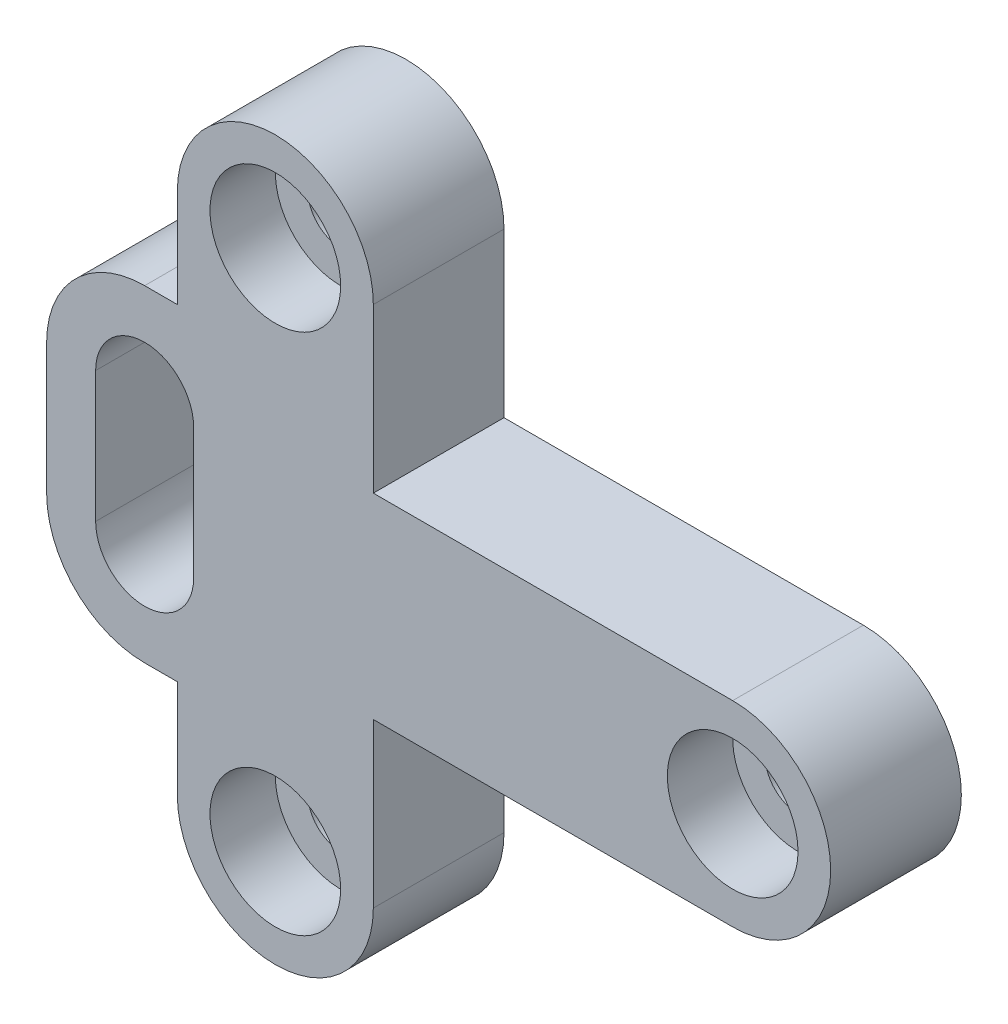
ISO-10303-21;
HEADER;
FILE_DESCRIPTION(('STEP AP214'),'2;1');
FILE_NAME('part.step','',(''),(''),'','','');
FILE_SCHEMA(('AUTOMOTIVE_DESIGN { 1 0 10303 214 1 1 1 1 }'));
ENDSEC;
DATA;
#1=APPLICATION_CONTEXT('core data for automotive mechanical design processes');
#2=APPLICATION_PROTOCOL_DEFINITION('international standard','automotive_design',2000,#1);
#3=PRODUCT_CONTEXT('',#1,'mechanical');
#4=PRODUCT('Part','Part','',(#3));
#5=PRODUCT_RELATED_PRODUCT_CATEGORY('part','',(#4));
#6=PRODUCT_DEFINITION_FORMATION('','',#4);
#7=PRODUCT_DEFINITION_CONTEXT('part definition',#1,'design');
#8=PRODUCT_DEFINITION('design','',#6,#7);
#9=PRODUCT_DEFINITION_SHAPE('','',#8);
#10=(LENGTH_UNIT() NAMED_UNIT(*) SI_UNIT(.MILLI.,.METRE.));
#11=(NAMED_UNIT(*) PLANE_ANGLE_UNIT() SI_UNIT($,.RADIAN.));
#12=(NAMED_UNIT(*) SI_UNIT($,.STERADIAN.) SOLID_ANGLE_UNIT());
#13=UNCERTAINTY_MEASURE_WITH_UNIT(LENGTH_MEASURE(1.E-05),#10,'distance_accuracy_value','');
#14=(GEOMETRIC_REPRESENTATION_CONTEXT(3) GLOBAL_UNCERTAINTY_ASSIGNED_CONTEXT((#13)) GLOBAL_UNIT_ASSIGNED_CONTEXT((#10,
#11,#12)) REPRESENTATION_CONTEXT('',''));
#15=CARTESIAN_POINT('',(0.,0.,0.));
#16=DIRECTION('',(0.,0.,1.));
#17=DIRECTION('',(1.,0.,0.));
#18=AXIS2_PLACEMENT_3D('',#15,#16,#17);
#19=CARTESIAN_POINT('',(-20.,-10.,20.));
#20=DIRECTION('',(0.,0.,-1.));
#21=DIRECTION('',(-1.,0.,0.));
#22=AXIS2_PLACEMENT_3D('',#19,#20,#21);
#23=CYLINDRICAL_SURFACE('',#22,7.5);
#24=CARTESIAN_POINT('',(-20.,-10.,0.));
#25=DIRECTION('',(0.,0.,1.));
#26=DIRECTION('',(1.,0.,0.));
#27=AXIS2_PLACEMENT_3D('',#24,#25,#26);
#28=CIRCLE('',#27,7.5);
#29=CARTESIAN_POINT('',(-27.5,-10.,0.));
#30=VERTEX_POINT('',#29);
#31=CARTESIAN_POINT('',(-12.5,-10.,0.));
#32=VERTEX_POINT('',#31);
#33=EDGE_CURVE('E241',#30,#32,#28,.T.);
#34=ORIENTED_EDGE('',*,*,#33,.F.);
#35=DIRECTION('',(0.,0.,-1.));
#36=VECTOR('',#35,1.);
#37=CARTESIAN_POINT('',(-27.5,-10.,20.));
#38=LINE('',#37,#36);
#39=CARTESIAN_POINT('',(-27.5,-10.,20.));
#40=VERTEX_POINT('',#39);
#41=EDGE_CURVE('E46',#40,#30,#38,.T.);
#42=ORIENTED_EDGE('',*,*,#41,.F.);
#43=CARTESIAN_POINT('',(-20.,-10.,20.));
#44=DIRECTION('',(0.,0.,1.));
#45=DIRECTION('',(1.,0.,0.));
#46=AXIS2_PLACEMENT_3D('',#43,#44,#45);
#47=CIRCLE('',#46,7.5);
#48=CARTESIAN_POINT('',(-12.5,-10.,20.));
#49=VERTEX_POINT('',#48);
#50=EDGE_CURVE('E187',#40,#49,#47,.T.);
#51=ORIENTED_EDGE('',*,*,#50,.T.);
#52=DIRECTION('',(0.,0.,-1.));
#53=VECTOR('',#52,1.);
#54=CARTESIAN_POINT('',(-12.5,-10.,20.));
#55=LINE('',#54,#53);
#56=EDGE_CURVE('E119',#49,#32,#55,.T.);
#57=ORIENTED_EDGE('',*,*,#56,.T.);
#58=EDGE_LOOP('',(#34,#42,#51,#57));
#59=FACE_BOUND('',#58,.T.);
#60=ADVANCED_FACE('F37',(#59),#23,.F.);
#61=CARTESIAN_POINT('',(-27.5,0.,20.));
#62=DIRECTION('',(1.,0.,0.));
#63=DIRECTION('',(0.,0.,-1.));
#64=AXIS2_PLACEMENT_3D('',#61,#62,#63);
#65=PLANE('',#64);
#66=DIRECTION('',(0.,-1.,0.));
#67=VECTOR('',#66,1.);
#68=CARTESIAN_POINT('',(-27.5,0.,0.));
#69=LINE('',#68,#67);
#70=CARTESIAN_POINT('',(-27.5,10.,0.));
#71=VERTEX_POINT('',#70);
#72=EDGE_CURVE('E178',#71,#30,#69,.T.);
#73=ORIENTED_EDGE('',*,*,#72,.F.);
#74=DIRECTION('',(0.,0.,-1.));
#75=VECTOR('',#74,1.);
#76=CARTESIAN_POINT('',(-27.5,10.,20.));
#77=LINE('',#76,#75);
#78=CARTESIAN_POINT('',(-27.5,10.,20.));
#79=VERTEX_POINT('',#78);
#80=EDGE_CURVE('E173',#79,#71,#77,.T.);
#81=ORIENTED_EDGE('',*,*,#80,.F.);
#82=DIRECTION('',(0.,-1.,0.));
#83=VECTOR('',#82,1.);
#84=CARTESIAN_POINT('',(-27.5,0.,20.));
#85=LINE('',#84,#83);
#86=EDGE_CURVE('E176',#79,#40,#85,.T.);
#87=ORIENTED_EDGE('',*,*,#86,.T.);
#88=ORIENTED_EDGE('',*,*,#41,.T.);
#89=EDGE_LOOP('',(#73,#81,#87,#88));
#90=FACE_BOUND('',#89,.T.);
#91=ADVANCED_FACE('F175',(#90),#65,.T.);
#92=CARTESIAN_POINT('',(-20.,10.,20.));
#93=DIRECTION('',(0.,0.,-1.));
#94=DIRECTION('',(-1.,0.,0.));
#95=AXIS2_PLACEMENT_3D('',#92,#93,#94);
#96=CYLINDRICAL_SURFACE('',#95,7.5);
#97=CARTESIAN_POINT('',(-20.,10.,0.));
#98=DIRECTION('',(0.,0.,1.));
#99=DIRECTION('',(1.,0.,0.));
#100=AXIS2_PLACEMENT_3D('',#97,#98,#99);
#101=CIRCLE('',#100,7.5);
#102=CARTESIAN_POINT('',(-12.5,10.,0.));
#103=VERTEX_POINT('',#102);
#104=EDGE_CURVE('E245',#103,#71,#101,.T.);
#105=ORIENTED_EDGE('',*,*,#104,.F.);
#106=DIRECTION('',(0.,0.,-1.));
#107=VECTOR('',#106,1.);
#108=CARTESIAN_POINT('',(-12.5,10.,20.));
#109=LINE('',#108,#107);
#110=CARTESIAN_POINT('',(-12.5,10.,20.));
#111=VERTEX_POINT('',#110);
#112=EDGE_CURVE('E112',#111,#103,#109,.T.);
#113=ORIENTED_EDGE('',*,*,#112,.F.);
#114=CARTESIAN_POINT('',(-20.,10.,20.));
#115=DIRECTION('',(0.,0.,1.));
#116=DIRECTION('',(1.,0.,0.));
#117=AXIS2_PLACEMENT_3D('',#114,#115,#116);
#118=CIRCLE('',#117,7.5);
#119=EDGE_CURVE('E186',#111,#79,#118,.T.);
#120=ORIENTED_EDGE('',*,*,#119,.T.);
#121=ORIENTED_EDGE('',*,*,#80,.T.);
#122=EDGE_LOOP('',(#105,#113,#120,#121));
#123=FACE_BOUND('',#122,.T.);
#124=ADVANCED_FACE('F189',(#123),#96,.F.);
#125=CARTESIAN_POINT('',(0.,-15.,20.));
#126=DIRECTION('',(0.,1.,0.));
#127=DIRECTION('',(0.,0.,1.));
#128=AXIS2_PLACEMENT_3D('',#125,#126,#127);
#129=PLANE('',#128);
#130=DIRECTION('',(1.,0.,0.));
#131=VECTOR('',#130,1.);
#132=CARTESIAN_POINT('',(0.,-15.,0.));
#133=LINE('',#132,#131);
#134=CARTESIAN_POINT('',(15.0006073792908,-15.,0.));
#135=VERTEX_POINT('',#134);
#136=CARTESIAN_POINT('',(70.0006073792907,-15.,0.));
#137=VERTEX_POINT('',#136);
#138=EDGE_CURVE('E204',#135,#137,#133,.T.);
#139=ORIENTED_EDGE('',*,*,#138,.T.);
#140=DIRECTION('',(0.,0.,-1.));
#141=VECTOR('',#140,1.);
#142=CARTESIAN_POINT('',(70.0006073792907,-15.,20.));
#143=LINE('',#142,#141);
#144=CARTESIAN_POINT('',(70.0006073792907,-15.,20.));
#145=VERTEX_POINT('',#144);
#146=EDGE_CURVE('E251',#145,#137,#143,.T.);
#147=ORIENTED_EDGE('',*,*,#146,.F.);
#148=DIRECTION('',(1.,0.,0.));
#149=VECTOR('',#148,1.);
#150=CARTESIAN_POINT('',(0.,-15.,20.));
#151=LINE('',#150,#149);
#152=CARTESIAN_POINT('',(15.0006073792908,-15.,20.));
#153=VERTEX_POINT('',#152);
#154=EDGE_CURVE('E249',#153,#145,#151,.T.);
#155=ORIENTED_EDGE('',*,*,#154,.F.);
#156=DIRECTION('',(0.,0.,-1.));
#157=VECTOR('',#156,1.);
#158=CARTESIAN_POINT('',(15.0006073792908,-15.,20.));
#159=LINE('',#158,#157);
#160=EDGE_CURVE('E203',#153,#135,#159,.T.);
#161=ORIENTED_EDGE('',*,*,#160,.T.);
#162=EDGE_LOOP('',(#139,#147,#155,#161));
#163=FACE_BOUND('',#162,.T.);
#164=ADVANCED_FACE('F39',(#163),#129,.F.);
#165=CARTESIAN_POINT('',(70.0006073792907,0.,20.));
#166=DIRECTION('',(0.,0.,-1.));
#167=DIRECTION('',(-1.,0.,0.));
#168=AXIS2_PLACEMENT_3D('',#165,#166,#167);
#169=CYLINDRICAL_SURFACE('',#168,15.);
#170=CARTESIAN_POINT('',(70.0006073792907,0.,0.));
#171=DIRECTION('',(0.,0.,1.));
#172=DIRECTION('',(1.,0.,0.));
#173=AXIS2_PLACEMENT_3D('',#170,#171,#172);
#174=CIRCLE('',#173,15.);
#175=CARTESIAN_POINT('',(70.0006073792907,15.,0.));
#176=VERTEX_POINT('',#175);
#177=EDGE_CURVE('E207',#137,#176,#174,.T.);
#178=ORIENTED_EDGE('',*,*,#177,.T.);
#179=DIRECTION('',(0.,0.,-1.));
#180=VECTOR('',#179,1.);
#181=CARTESIAN_POINT('',(70.0006073792907,15.,20.));
#182=LINE('',#181,#180);
#183=CARTESIAN_POINT('',(70.0006073792907,15.,20.));
#184=VERTEX_POINT('',#183);
#185=EDGE_CURVE('E283',#184,#176,#182,.T.);
#186=ORIENTED_EDGE('',*,*,#185,.F.);
#187=CARTESIAN_POINT('',(70.0006073792907,0.,20.));
#188=DIRECTION('',(0.,0.,1.));
#189=DIRECTION('',(1.,0.,0.));
#190=AXIS2_PLACEMENT_3D('',#187,#188,#189);
#191=CIRCLE('',#190,15.);
#192=EDGE_CURVE('E127',#145,#184,#191,.T.);
#193=ORIENTED_EDGE('',*,*,#192,.F.);
#194=ORIENTED_EDGE('',*,*,#146,.T.);
#195=EDGE_LOOP('',(#178,#186,#193,#194));
#196=FACE_BOUND('',#195,.T.);
#197=ADVANCED_FACE('F285',(#196),#169,.T.);
#198=CARTESIAN_POINT('',(0.,15.,20.));
#199=DIRECTION('',(0.,1.,0.));
#200=DIRECTION('',(0.,0.,1.));
#201=AXIS2_PLACEMENT_3D('',#198,#199,#200);
#202=PLANE('',#201);
#203=DIRECTION('',(1.,0.,0.));
#204=VECTOR('',#203,1.);
#205=CARTESIAN_POINT('',(0.,15.,0.));
#206=LINE('',#205,#204);
#207=CARTESIAN_POINT('',(15.0006073792907,15.,0.));
#208=VERTEX_POINT('',#207);
#209=EDGE_CURVE('E211',#208,#176,#206,.T.);
#210=ORIENTED_EDGE('',*,*,#209,.F.);
#211=DIRECTION('',(0.,0.,-1.));
#212=VECTOR('',#211,1.);
#213=CARTESIAN_POINT('',(15.0006073792907,15.,20.));
#214=LINE('',#213,#212);
#215=CARTESIAN_POINT('',(15.0006073792907,15.,20.));
#216=VERTEX_POINT('',#215);
#217=EDGE_CURVE('E281',#216,#208,#214,.T.);
#218=ORIENTED_EDGE('',*,*,#217,.F.);
#219=DIRECTION('',(1.,0.,0.));
#220=VECTOR('',#219,1.);
#221=CARTESIAN_POINT('',(0.,15.,20.));
#222=LINE('',#221,#220);
#223=EDGE_CURVE('E362',#216,#184,#222,.T.);
#224=ORIENTED_EDGE('',*,*,#223,.T.);
#225=ORIENTED_EDGE('',*,*,#185,.T.);
#226=EDGE_LOOP('',(#210,#218,#224,#225));
#227=FACE_BOUND('',#226,.T.);
#228=ADVANCED_FACE('F359',(#227),#202,.T.);
#229=CARTESIAN_POINT('',(15.0006073792907,0.,20.));
#230=DIRECTION('',(1.,0.,0.));
#231=DIRECTION('',(0.,1.,0.));
#232=AXIS2_PLACEMENT_3D('',#229,#230,#231);
#233=PLANE('',#232);
#234=DIRECTION('',(0.,-1.,0.));
#235=VECTOR('',#234,1.);
#236=CARTESIAN_POINT('',(15.0006073792907,0.,0.));
#237=LINE('',#236,#235);
#238=CARTESIAN_POINT('',(15.0006073792907,40.,0.));
#239=VERTEX_POINT('',#238);
#240=EDGE_CURVE('E214',#239,#208,#237,.T.);
#241=ORIENTED_EDGE('',*,*,#240,.F.);
#242=DIRECTION('',(0.,0.,-1.));
#243=VECTOR('',#242,1.);
#244=CARTESIAN_POINT('',(15.0006073792907,40.,20.));
#245=LINE('',#244,#243);
#246=CARTESIAN_POINT('',(15.0006073792907,40.,20.));
#247=VERTEX_POINT('',#246);
#248=EDGE_CURVE('E279',#247,#239,#245,.T.);
#249=ORIENTED_EDGE('',*,*,#248,.F.);
#250=DIRECTION('',(0.,-1.,0.));
#251=VECTOR('',#250,1.);
#252=CARTESIAN_POINT('',(15.0006073792907,0.,20.));
#253=LINE('',#252,#251);
#254=EDGE_CURVE('E356',#247,#216,#253,.T.);
#255=ORIENTED_EDGE('',*,*,#254,.T.);
#256=ORIENTED_EDGE('',*,*,#217,.T.);
#257=EDGE_LOOP('',(#241,#249,#255,#256));
#258=FACE_BOUND('',#257,.T.);
#259=ADVANCED_FACE('F355',(#258),#233,.T.);
#260=CARTESIAN_POINT('',(0.000607379290722194,40.,20.));
#261=DIRECTION('',(0.,0.,-1.));
#262=DIRECTION('',(-1.,0.,0.));
#263=AXIS2_PLACEMENT_3D('',#260,#261,#262);
#264=CYLINDRICAL_SURFACE('',#263,15.);
#265=CARTESIAN_POINT('',(0.000607379290722194,40.,0.));
#266=DIRECTION('',(0.,0.,1.));
#267=DIRECTION('',(1.,0.,0.));
#268=AXIS2_PLACEMENT_3D('',#265,#266,#267);
#269=CIRCLE('',#268,15.);
#270=CARTESIAN_POINT('',(-14.9993926207093,40.,0.));
#271=VERTEX_POINT('',#270);
#272=EDGE_CURVE('E217',#239,#271,#269,.T.);
#273=ORIENTED_EDGE('',*,*,#272,.T.);
#274=DIRECTION('',(0.,0.,-1.));
#275=VECTOR('',#274,1.);
#276=CARTESIAN_POINT('',(-14.9993926207093,40.,20.));
#277=LINE('',#276,#275);
#278=CARTESIAN_POINT('',(-14.9993926207093,40.,20.));
#279=VERTEX_POINT('',#278);
#280=EDGE_CURVE('E276',#279,#271,#277,.T.);
#281=ORIENTED_EDGE('',*,*,#280,.F.);
#282=CARTESIAN_POINT('',(0.000607379290722194,40.,20.));
#283=DIRECTION('',(0.,0.,1.));
#284=DIRECTION('',(1.,0.,0.));
#285=AXIS2_PLACEMENT_3D('',#282,#283,#284);
#286=CIRCLE('',#285,15.);
#287=EDGE_CURVE('E351',#247,#279,#286,.T.);
#288=ORIENTED_EDGE('',*,*,#287,.F.);
#289=ORIENTED_EDGE('',*,*,#248,.T.);
#290=EDGE_LOOP('',(#273,#281,#288,#289));
#291=FACE_BOUND('',#290,.T.);
#292=ADVANCED_FACE('F350',(#291),#264,.T.);
#293=CARTESIAN_POINT('',(-14.9993926207092,0.,20.));
#294=DIRECTION('',(1.,0.,0.));
#295=DIRECTION('',(0.,1.,0.));
#296=AXIS2_PLACEMENT_3D('',#293,#294,#295);
#297=PLANE('',#296);
#298=DIRECTION('',(0.,-1.,0.));
#299=VECTOR('',#298,1.);
#300=CARTESIAN_POINT('',(-14.9993926207092,0.,0.));
#301=LINE('',#300,#299);
#302=CARTESIAN_POINT('',(-14.9993926207093,25.,0.));
#303=VERTEX_POINT('',#302);
#304=EDGE_CURVE('E219',#271,#303,#301,.T.);
#305=ORIENTED_EDGE('',*,*,#304,.T.);
#306=DIRECTION('',(0.,0.,-1.));
#307=VECTOR('',#306,1.);
#308=CARTESIAN_POINT('',(-14.9993926207093,25.,20.));
#309=LINE('',#308,#307);
#310=CARTESIAN_POINT('',(-14.9993926207093,25.,20.));
#311=VERTEX_POINT('',#310);
#312=EDGE_CURVE('E274',#311,#303,#309,.T.);
#313=ORIENTED_EDGE('',*,*,#312,.F.);
#314=DIRECTION('',(0.,-1.,0.));
#315=VECTOR('',#314,1.);
#316=CARTESIAN_POINT('',(-14.9993926207092,0.,20.));
#317=LINE('',#316,#315);
#318=EDGE_CURVE('E347',#279,#311,#317,.T.);
#319=ORIENTED_EDGE('',*,*,#318,.F.);
#320=ORIENTED_EDGE('',*,*,#280,.T.);
#321=EDGE_LOOP('',(#305,#313,#319,#320));
#322=FACE_BOUND('',#321,.T.);
#323=ADVANCED_FACE('F344',(#322),#297,.F.);
#324=CARTESIAN_POINT('',(0.,25.,20.));
#325=DIRECTION('',(0.,1.,0.));
#326=DIRECTION('',(0.,0.,1.));
#327=AXIS2_PLACEMENT_3D('',#324,#325,#326);
#328=PLANE('',#327);
#329=DIRECTION('',(1.,0.,0.));
#330=VECTOR('',#329,1.);
#331=CARTESIAN_POINT('',(0.,25.,0.));
#332=LINE('',#331,#330);
#333=CARTESIAN_POINT('',(-20.,25.,0.));
#334=VERTEX_POINT('',#333);
#335=EDGE_CURVE('E222',#334,#303,#332,.T.);
#336=ORIENTED_EDGE('',*,*,#335,.F.);
#337=DIRECTION('',(0.,0.,-1.));
#338=VECTOR('',#337,1.);
#339=CARTESIAN_POINT('',(-20.,25.,20.));
#340=LINE('',#339,#338);
#341=CARTESIAN_POINT('',(-20.,25.,20.));
#342=VERTEX_POINT('',#341);
#343=EDGE_CURVE('E272',#342,#334,#340,.T.);
#344=ORIENTED_EDGE('',*,*,#343,.F.);
#345=DIRECTION('',(1.,0.,0.));
#346=VECTOR('',#345,1.);
#347=CARTESIAN_POINT('',(0.,25.,20.));
#348=LINE('',#347,#346);
#349=EDGE_CURVE('E338',#342,#311,#348,.T.);
#350=ORIENTED_EDGE('',*,*,#349,.T.);
#351=ORIENTED_EDGE('',*,*,#312,.T.);
#352=EDGE_LOOP('',(#336,#344,#350,#351));
#353=FACE_BOUND('',#352,.T.);
#354=ADVANCED_FACE('F337',(#353),#328,.T.);
#355=CARTESIAN_POINT('',(-20.,10.,20.));
#356=DIRECTION('',(0.,0.,-1.));
#357=DIRECTION('',(-1.,0.,0.));
#358=AXIS2_PLACEMENT_3D('',#355,#356,#357);
#359=CYLINDRICAL_SURFACE('',#358,15.);
#360=CARTESIAN_POINT('',(-20.,10.,0.));
#361=DIRECTION('',(0.,0.,1.));
#362=DIRECTION('',(1.,0.,0.));
#363=AXIS2_PLACEMENT_3D('',#360,#361,#362);
#364=CIRCLE('',#363,15.);
#365=CARTESIAN_POINT('',(-35.,10.,0.));
#366=VERTEX_POINT('',#365);
#367=EDGE_CURVE('E225',#334,#366,#364,.T.);
#368=ORIENTED_EDGE('',*,*,#367,.T.);
#369=DIRECTION('',(0.,0.,-1.));
#370=VECTOR('',#369,1.);
#371=CARTESIAN_POINT('',(-35.,10.,20.));
#372=LINE('',#371,#370);
#373=CARTESIAN_POINT('',(-35.,10.,20.));
#374=VERTEX_POINT('',#373);
#375=EDGE_CURVE('E269',#374,#366,#372,.T.);
#376=ORIENTED_EDGE('',*,*,#375,.F.);
#377=CARTESIAN_POINT('',(-20.,10.,20.));
#378=DIRECTION('',(0.,0.,1.));
#379=DIRECTION('',(1.,0.,0.));
#380=AXIS2_PLACEMENT_3D('',#377,#378,#379);
#381=CIRCLE('',#380,15.);
#382=EDGE_CURVE('E333',#342,#374,#381,.T.);
#383=ORIENTED_EDGE('',*,*,#382,.F.);
#384=ORIENTED_EDGE('',*,*,#343,.T.);
#385=EDGE_LOOP('',(#368,#376,#383,#384));
#386=FACE_BOUND('',#385,.T.);
#387=ADVANCED_FACE('F332',(#386),#359,.T.);
#388=CARTESIAN_POINT('',(-35.,0.,20.));
#389=DIRECTION('',(1.,0.,0.));
#390=DIRECTION('',(0.,0.,-1.));
#391=AXIS2_PLACEMENT_3D('',#388,#389,#390);
#392=PLANE('',#391);
#393=DIRECTION('',(0.,-1.,0.));
#394=VECTOR('',#393,1.);
#395=CARTESIAN_POINT('',(-35.,0.,0.));
#396=LINE('',#395,#394);
#397=CARTESIAN_POINT('',(-35.,-10.,0.));
#398=VERTEX_POINT('',#397);
#399=EDGE_CURVE('E227',#366,#398,#396,.T.);
#400=ORIENTED_EDGE('',*,*,#399,.T.);
#401=DIRECTION('',(0.,0.,-1.));
#402=VECTOR('',#401,1.);
#403=CARTESIAN_POINT('',(-35.,-10.,20.));
#404=LINE('',#403,#402);
#405=CARTESIAN_POINT('',(-35.,-10.,20.));
#406=VERTEX_POINT('',#405);
#407=EDGE_CURVE('E266',#406,#398,#404,.T.);
#408=ORIENTED_EDGE('',*,*,#407,.F.);
#409=DIRECTION('',(0.,-1.,0.));
#410=VECTOR('',#409,1.);
#411=CARTESIAN_POINT('',(-35.,0.,20.));
#412=LINE('',#411,#410);
#413=EDGE_CURVE('E329',#374,#406,#412,.T.);
#414=ORIENTED_EDGE('',*,*,#413,.F.);
#415=ORIENTED_EDGE('',*,*,#375,.T.);
#416=EDGE_LOOP('',(#400,#408,#414,#415));
#417=FACE_BOUND('',#416,.T.);
#418=ADVANCED_FACE('F326',(#417),#392,.F.);
#419=CARTESIAN_POINT('',(-20.,-10.,20.));
#420=DIRECTION('',(0.,0.,-1.));
#421=DIRECTION('',(-1.,0.,0.));
#422=AXIS2_PLACEMENT_3D('',#419,#420,#421);
#423=CYLINDRICAL_SURFACE('',#422,15.);
#424=CARTESIAN_POINT('',(-20.,-10.,0.));
#425=DIRECTION('',(0.,0.,1.));
#426=DIRECTION('',(1.,0.,0.));
#427=AXIS2_PLACEMENT_3D('',#424,#425,#426);
#428=CIRCLE('',#427,15.);
#429=CARTESIAN_POINT('',(-20.,-25.,0.));
#430=VERTEX_POINT('',#429);
#431=EDGE_CURVE('E229',#398,#430,#428,.T.);
#432=ORIENTED_EDGE('',*,*,#431,.T.);
#433=DIRECTION('',(0.,0.,-1.));
#434=VECTOR('',#433,1.);
#435=CARTESIAN_POINT('',(-20.,-25.,20.));
#436=LINE('',#435,#434);
#437=CARTESIAN_POINT('',(-20.,-25.,20.));
#438=VERTEX_POINT('',#437);
#439=EDGE_CURVE('E263',#438,#430,#436,.T.);
#440=ORIENTED_EDGE('',*,*,#439,.F.);
#441=CARTESIAN_POINT('',(-20.,-10.,20.));
#442=DIRECTION('',(0.,0.,1.));
#443=DIRECTION('',(1.,0.,0.));
#444=AXIS2_PLACEMENT_3D('',#441,#442,#443);
#445=CIRCLE('',#444,15.);
#446=EDGE_CURVE('E320',#406,#438,#445,.T.);
#447=ORIENTED_EDGE('',*,*,#446,.F.);
#448=ORIENTED_EDGE('',*,*,#407,.T.);
#449=EDGE_LOOP('',(#432,#440,#447,#448));
#450=FACE_BOUND('',#449,.T.);
#451=ADVANCED_FACE('F319',(#450),#423,.T.);
#452=CARTESIAN_POINT('',(0.,-25.,20.));
#453=DIRECTION('',(0.,1.,0.));
#454=DIRECTION('',(-1.,0.,0.));
#455=AXIS2_PLACEMENT_3D('',#452,#453,#454);
#456=PLANE('',#455);
#457=DIRECTION('',(1.,0.,0.));
#458=VECTOR('',#457,1.);
#459=CARTESIAN_POINT('',(0.,-25.,0.));
#460=LINE('',#459,#458);
#461=CARTESIAN_POINT('',(-14.9993926207093,-25.,0.));
#462=VERTEX_POINT('',#461);
#463=EDGE_CURVE('E231',#430,#462,#460,.T.);
#464=ORIENTED_EDGE('',*,*,#463,.T.);
#465=DIRECTION('',(0.,0.,-1.));
#466=VECTOR('',#465,1.);
#467=CARTESIAN_POINT('',(-14.9993926207093,-25.,20.));
#468=LINE('',#467,#466);
#469=CARTESIAN_POINT('',(-14.9993926207093,-25.,20.));
#470=VERTEX_POINT('',#469);
#471=EDGE_CURVE('E260',#470,#462,#468,.T.);
#472=ORIENTED_EDGE('',*,*,#471,.F.);
#473=DIRECTION('',(1.,0.,0.));
#474=VECTOR('',#473,1.);
#475=CARTESIAN_POINT('',(0.,-25.,20.));
#476=LINE('',#475,#474);
#477=EDGE_CURVE('E315',#438,#470,#476,.T.);
#478=ORIENTED_EDGE('',*,*,#477,.F.);
#479=ORIENTED_EDGE('',*,*,#439,.T.);
#480=EDGE_LOOP('',(#464,#472,#478,#479));
#481=FACE_BOUND('',#480,.T.);
#482=ADVANCED_FACE('F314',(#481),#456,.F.);
#483=CARTESIAN_POINT('',(-14.9993926207092,0.,20.));
#484=DIRECTION('',(1.,0.,0.));
#485=DIRECTION('',(0.,1.,0.));
#486=AXIS2_PLACEMENT_3D('',#483,#484,#485);
#487=PLANE('',#486);
#488=DIRECTION('',(0.,-1.,0.));
#489=VECTOR('',#488,1.);
#490=CARTESIAN_POINT('',(-14.9993926207092,0.,0.));
#491=LINE('',#490,#489);
#492=CARTESIAN_POINT('',(-14.9993926207093,-40.,0.));
#493=VERTEX_POINT('',#492);
#494=EDGE_CURVE('E233',#462,#493,#491,.T.);
#495=ORIENTED_EDGE('',*,*,#494,.T.);
#496=DIRECTION('',(0.,0.,-1.));
#497=VECTOR('',#496,1.);
#498=CARTESIAN_POINT('',(-14.9993926207093,-40.,20.));
#499=LINE('',#498,#497);
#500=CARTESIAN_POINT('',(-14.9993926207093,-40.,20.));
#501=VERTEX_POINT('',#500);
#502=EDGE_CURVE('E257',#501,#493,#499,.T.);
#503=ORIENTED_EDGE('',*,*,#502,.F.);
#504=DIRECTION('',(0.,-1.,0.));
#505=VECTOR('',#504,1.);
#506=CARTESIAN_POINT('',(-14.9993926207092,0.,20.));
#507=LINE('',#506,#505);
#508=EDGE_CURVE('E311',#470,#501,#507,.T.);
#509=ORIENTED_EDGE('',*,*,#508,.F.);
#510=ORIENTED_EDGE('',*,*,#471,.T.);
#511=EDGE_LOOP('',(#495,#503,#509,#510));
#512=FACE_BOUND('',#511,.T.);
#513=ADVANCED_FACE('F308',(#512),#487,.F.);
#514=CARTESIAN_POINT('',(0.000607379290748011,-40.,20.));
#515=DIRECTION('',(0.,0.,-1.));
#516=DIRECTION('',(-1.,0.,0.));
#517=AXIS2_PLACEMENT_3D('',#514,#515,#516);
#518=CYLINDRICAL_SURFACE('',#517,15.);
#519=CARTESIAN_POINT('',(0.000607379290748011,-40.,0.));
#520=DIRECTION('',(0.,0.,1.));
#521=DIRECTION('',(1.,0.,0.));
#522=AXIS2_PLACEMENT_3D('',#519,#520,#521);
#523=CIRCLE('',#522,15.);
#524=CARTESIAN_POINT('',(15.0006073792908,-40.,0.));
#525=VERTEX_POINT('',#524);
#526=EDGE_CURVE('E235',#493,#525,#523,.T.);
#527=ORIENTED_EDGE('',*,*,#526,.T.);
#528=DIRECTION('',(0.,0.,-1.));
#529=VECTOR('',#528,1.);
#530=CARTESIAN_POINT('',(15.0006073792908,-40.,20.));
#531=LINE('',#530,#529);
#532=CARTESIAN_POINT('',(15.0006073792908,-40.,20.));
#533=VERTEX_POINT('',#532);
#534=EDGE_CURVE('E255',#533,#525,#531,.T.);
#535=ORIENTED_EDGE('',*,*,#534,.F.);
#536=CARTESIAN_POINT('',(0.000607379290748011,-40.,20.));
#537=DIRECTION('',(0.,0.,1.));
#538=DIRECTION('',(1.,0.,0.));
#539=AXIS2_PLACEMENT_3D('',#536,#537,#538);
#540=CIRCLE('',#539,15.);
#541=EDGE_CURVE('E377',#501,#533,#540,.T.);
#542=ORIENTED_EDGE('',*,*,#541,.F.);
#543=ORIENTED_EDGE('',*,*,#502,.T.);
#544=EDGE_LOOP('',(#527,#535,#542,#543));
#545=FACE_BOUND('',#544,.T.);
#546=ADVANCED_FACE('F302',(#545),#518,.T.);
#547=CARTESIAN_POINT('',(0.000607379290722194,40.,20.));
#548=DIRECTION('',(0.,0.,-1.));
#549=DIRECTION('',(-1.,0.,0.));
#550=AXIS2_PLACEMENT_3D('',#547,#548,#549);
#551=CYLINDRICAL_SURFACE('',#550,10.);
#552=CARTESIAN_POINT('',(0.000607379290722194,40.,10.));
#553=DIRECTION('',(0.,0.,1.));
#554=DIRECTION('',(1.,0.,0.));
#555=AXIS2_PLACEMENT_3D('',#552,#553,#554);
#556=CIRCLE('',#555,10.);
#557=CARTESIAN_POINT('',(10.0006073792907,40.,10.));
#558=VERTEX_POINT('',#557);
#559=EDGE_CURVE('E648',#558,#558,#556,.F.);
#560=ORIENTED_EDGE('',*,*,#559,.T.);
#561=EDGE_LOOP('',(#560));
#562=FACE_BOUND('',#561,.T.);
#563=CARTESIAN_POINT('',(0.000607379290722194,40.,20.));
#564=DIRECTION('',(0.,0.,1.));
#565=DIRECTION('',(1.,0.,0.));
#566=AXIS2_PLACEMENT_3D('',#563,#564,#565);
#567=CIRCLE('',#566,10.);
#568=CARTESIAN_POINT('',(10.0006073792907,40.,20.));
#569=VERTEX_POINT('',#568);
#570=EDGE_CURVE('E197',#569,#569,#567,.F.);
#571=ORIENTED_EDGE('',*,*,#570,.F.);
#572=EDGE_LOOP('',(#571));
#573=FACE_BOUND('',#572,.T.);
#574=ADVANCED_FACE('F390',(#562,#573),#551,.F.);
#575=CARTESIAN_POINT('',(0.000607379290748011,-40.,20.));
#576=DIRECTION('',(0.,0.,-1.));
#577=DIRECTION('',(-1.,0.,0.));
#578=AXIS2_PLACEMENT_3D('',#575,#576,#577);
#579=CYLINDRICAL_SURFACE('',#578,10.);
#580=CARTESIAN_POINT('',(0.000607379290748011,-40.,10.));
#581=DIRECTION('',(0.,0.,1.));
#582=DIRECTION('',(1.,0.,0.));
#583=AXIS2_PLACEMENT_3D('',#580,#581,#582);
#584=CIRCLE('',#583,10.);
#585=CARTESIAN_POINT('',(10.0006073792908,-40.,10.));
#586=VERTEX_POINT('',#585);
#587=EDGE_CURVE('E11',#586,#586,#584,.T.);
#588=ORIENTED_EDGE('',*,*,#587,.F.);
#589=EDGE_LOOP('',(#588));
#590=FACE_BOUND('',#589,.T.);
#591=CARTESIAN_POINT('',(0.000607379290748011,-40.,20.));
#592=DIRECTION('',(0.,0.,1.));
#593=DIRECTION('',(1.,0.,0.));
#594=AXIS2_PLACEMENT_3D('',#591,#592,#593);
#595=CIRCLE('',#594,10.);
#596=CARTESIAN_POINT('',(10.0006073792908,-40.,20.));
#597=VERTEX_POINT('',#596);
#598=EDGE_CURVE('E191',#597,#597,#595,.T.);
#599=ORIENTED_EDGE('',*,*,#598,.T.);
#600=EDGE_LOOP('',(#599));
#601=FACE_BOUND('',#600,.T.);
#602=ADVANCED_FACE('F382',(#590,#601),#579,.F.);
#603=CARTESIAN_POINT('',(-12.5,0.,20.));
#604=DIRECTION('',(1.,0.,0.));
#605=DIRECTION('',(0.,0.,-1.));
#606=AXIS2_PLACEMENT_3D('',#603,#604,#605);
#607=PLANE('',#606);
#608=DIRECTION('',(0.,-1.,0.));
#609=VECTOR('',#608,1.);
#610=CARTESIAN_POINT('',(-12.5,0.,0.));
#611=LINE('',#610,#609);
#612=EDGE_CURVE('E247',#103,#32,#611,.T.);
#613=ORIENTED_EDGE('',*,*,#612,.T.);
#614=ORIENTED_EDGE('',*,*,#56,.F.);
#615=DIRECTION('',(0.,-1.,0.));
#616=VECTOR('',#615,1.);
#617=CARTESIAN_POINT('',(-12.5,0.,20.));
#618=LINE('',#617,#616);
#619=EDGE_CURVE('E54',#111,#49,#618,.T.);
#620=ORIENTED_EDGE('',*,*,#619,.F.);
#621=ORIENTED_EDGE('',*,*,#112,.T.);
#622=EDGE_LOOP('',(#613,#614,#620,#621));
#623=FACE_BOUND('',#622,.T.);
#624=ADVANCED_FACE('F380',(#623),#607,.F.);
#625=CARTESIAN_POINT('',(15.0006073792907,0.,20.));
#626=DIRECTION('',(1.,0.,0.));
#627=DIRECTION('',(0.,1.,0.));
#628=AXIS2_PLACEMENT_3D('',#625,#626,#627);
#629=PLANE('',#628);
#630=DIRECTION('',(0.,-1.,0.));
#631=VECTOR('',#630,1.);
#632=CARTESIAN_POINT('',(15.0006073792907,0.,0.));
#633=LINE('',#632,#631);
#634=EDGE_CURVE('E238',#135,#525,#633,.T.);
#635=ORIENTED_EDGE('',*,*,#634,.F.);
#636=ORIENTED_EDGE('',*,*,#160,.F.);
#637=DIRECTION('',(0.,-1.,0.));
#638=VECTOR('',#637,1.);
#639=CARTESIAN_POINT('',(15.0006073792907,0.,20.));
#640=LINE('',#639,#638);
#641=EDGE_CURVE('E299',#153,#533,#640,.T.);
#642=ORIENTED_EDGE('',*,*,#641,.T.);
#643=ORIENTED_EDGE('',*,*,#534,.T.);
#644=EDGE_LOOP('',(#635,#636,#642,#643));
#645=FACE_BOUND('',#644,.T.);
#646=ADVANCED_FACE('F295',(#645),#629,.T.);
#647=CARTESIAN_POINT('',(70.0006073792907,0.,20.));
#648=DIRECTION('',(0.,0.,-1.));
#649=DIRECTION('',(-1.,0.,0.));
#650=AXIS2_PLACEMENT_3D('',#647,#648,#649);
#651=CYLINDRICAL_SURFACE('',#650,10.);
#652=CARTESIAN_POINT('',(70.0006073792907,0.,10.));
#653=DIRECTION('',(0.,0.,1.));
#654=DIRECTION('',(1.,0.,0.));
#655=AXIS2_PLACEMENT_3D('',#652,#653,#654);
#656=CIRCLE('',#655,10.);
#657=CARTESIAN_POINT('',(80.0006073792907,0.,10.));
#658=VERTEX_POINT('',#657);
#659=EDGE_CURVE('E631',#658,#658,#656,.F.);
#660=ORIENTED_EDGE('',*,*,#659,.T.);
#661=EDGE_LOOP('',(#660));
#662=FACE_BOUND('',#661,.T.);
#663=CARTESIAN_POINT('',(70.0006073792907,0.,20.));
#664=DIRECTION('',(0.,0.,1.));
#665=DIRECTION('',(1.,0.,0.));
#666=AXIS2_PLACEMENT_3D('',#663,#664,#665);
#667=CIRCLE('',#666,10.);
#668=CARTESIAN_POINT('',(80.0006073792907,0.,20.));
#669=VERTEX_POINT('',#668);
#670=EDGE_CURVE('E200',#669,#669,#667,.F.);
#671=ORIENTED_EDGE('',*,*,#670,.F.);
#672=EDGE_LOOP('',(#671));
#673=FACE_BOUND('',#672,.T.);
#674=ADVANCED_FACE('F388',(#662,#673),#651,.F.);
#675=CARTESIAN_POINT('',(0.,0.,20.));
#676=DIRECTION('',(0.,0.,1.));
#677=DIRECTION('',(1.,0.,0.));
#678=AXIS2_PLACEMENT_3D('',#675,#676,#677);
#679=PLANE('',#678);
#680=ORIENTED_EDGE('',*,*,#154,.T.);
#681=ORIENTED_EDGE('',*,*,#192,.T.);
#682=ORIENTED_EDGE('',*,*,#223,.F.);
#683=ORIENTED_EDGE('',*,*,#254,.F.);
#684=ORIENTED_EDGE('',*,*,#287,.T.);
#685=ORIENTED_EDGE('',*,*,#318,.T.);
#686=ORIENTED_EDGE('',*,*,#349,.F.);
#687=ORIENTED_EDGE('',*,*,#382,.T.);
#688=ORIENTED_EDGE('',*,*,#413,.T.);
#689=ORIENTED_EDGE('',*,*,#446,.T.);
#690=ORIENTED_EDGE('',*,*,#477,.T.);
#691=ORIENTED_EDGE('',*,*,#508,.T.);
#692=ORIENTED_EDGE('',*,*,#541,.T.);
#693=ORIENTED_EDGE('',*,*,#641,.F.);
#694=EDGE_LOOP('',(#680,#681,#682,#683,#684,#685,#686,#687,#688,#689,#690,#691,#692,#693));
#695=FACE_BOUND('',#694,.T.);
#696=ORIENTED_EDGE('',*,*,#50,.F.);
#697=ORIENTED_EDGE('',*,*,#86,.F.);
#698=ORIENTED_EDGE('',*,*,#119,.F.);
#699=ORIENTED_EDGE('',*,*,#619,.T.);
#700=EDGE_LOOP('',(#696,#697,#698,#699));
#701=FACE_BOUND('',#700,.T.);
#702=ORIENTED_EDGE('',*,*,#598,.F.);
#703=EDGE_LOOP('',(#702));
#704=FACE_BOUND('',#703,.T.);
#705=ORIENTED_EDGE('',*,*,#570,.T.);
#706=EDGE_LOOP('',(#705));
#707=FACE_BOUND('',#706,.T.);
#708=ORIENTED_EDGE('',*,*,#670,.T.);
#709=EDGE_LOOP('',(#708));
#710=FACE_BOUND('',#709,.T.);
#711=ADVANCED_FACE('F184',(#695,#701,#704,#707,#710),#679,.T.);
#712=CARTESIAN_POINT('',(0.,0.,0.));
#713=DIRECTION('',(0.,0.,1.));
#714=DIRECTION('',(1.,0.,0.));
#715=AXIS2_PLACEMENT_3D('',#712,#713,#714);
#716=PLANE('',#715);
#717=ORIENTED_EDGE('',*,*,#138,.F.);
#718=ORIENTED_EDGE('',*,*,#634,.T.);
#719=ORIENTED_EDGE('',*,*,#526,.F.);
#720=ORIENTED_EDGE('',*,*,#494,.F.);
#721=ORIENTED_EDGE('',*,*,#463,.F.);
#722=ORIENTED_EDGE('',*,*,#431,.F.);
#723=ORIENTED_EDGE('',*,*,#399,.F.);
#724=ORIENTED_EDGE('',*,*,#367,.F.);
#725=ORIENTED_EDGE('',*,*,#335,.T.);
#726=ORIENTED_EDGE('',*,*,#304,.F.);
#727=ORIENTED_EDGE('',*,*,#272,.F.);
#728=ORIENTED_EDGE('',*,*,#240,.T.);
#729=ORIENTED_EDGE('',*,*,#209,.T.);
#730=ORIENTED_EDGE('',*,*,#177,.F.);
#731=EDGE_LOOP('',(#717,#718,#719,#720,#721,#722,#723,#724,#725,#726,#727,#728,#729,#730));
#732=FACE_BOUND('',#731,.T.);
#733=ORIENTED_EDGE('',*,*,#33,.T.);
#734=ORIENTED_EDGE('',*,*,#612,.F.);
#735=ORIENTED_EDGE('',*,*,#104,.T.);
#736=ORIENTED_EDGE('',*,*,#72,.T.);
#737=EDGE_LOOP('',(#733,#734,#735,#736));
#738=FACE_BOUND('',#737,.T.);
#739=CARTESIAN_POINT('',(0.000607379290722194,40.,0.));
#740=DIRECTION('',(0.,0.,1.));
#741=DIRECTION('',(1.,0.,0.));
#742=AXIS2_PLACEMENT_3D('',#739,#740,#741);
#743=CIRCLE('',#742,5.00000000000001);
#744=CARTESIAN_POINT('',(5.00060737929073,40.,0.));
#745=VERTEX_POINT('',#744);
#746=EDGE_CURVE('E646',#745,#745,#743,.F.);
#747=ORIENTED_EDGE('',*,*,#746,.F.);
#748=EDGE_LOOP('',(#747));
#749=FACE_BOUND('',#748,.T.);
#750=CARTESIAN_POINT('',(0.000607379290748011,-40.,0.));
#751=DIRECTION('',(0.,0.,1.));
#752=DIRECTION('',(1.,0.,0.));
#753=AXIS2_PLACEMENT_3D('',#750,#751,#752);
#754=CIRCLE('',#753,5.);
#755=CARTESIAN_POINT('',(5.00060737929075,-40.,0.));
#756=VERTEX_POINT('',#755);
#757=EDGE_CURVE('E635',#756,#756,#754,.T.);
#758=ORIENTED_EDGE('',*,*,#757,.T.);
#759=EDGE_LOOP('',(#758));
#760=FACE_BOUND('',#759,.T.);
#761=CARTESIAN_POINT('',(70.0006073792907,0.,0.));
#762=DIRECTION('',(0.,0.,1.));
#763=DIRECTION('',(1.,0.,0.));
#764=AXIS2_PLACEMENT_3D('',#761,#762,#763);
#765=CIRCLE('',#764,5.);
#766=CARTESIAN_POINT('',(75.0006073792907,0.,0.));
#767=VERTEX_POINT('',#766);
#768=EDGE_CURVE('E640',#767,#767,#765,.F.);
#769=ORIENTED_EDGE('',*,*,#768,.F.);
#770=EDGE_LOOP('',(#769));
#771=FACE_BOUND('',#770,.T.);
#772=ADVANCED_FACE('F291',(#732,#738,#749,#760,#771),#716,.F.);
#773=CARTESIAN_POINT('',(0.000607379290722194,40.,10.));
#774=DIRECTION('',(0.,0.,-1.));
#775=DIRECTION('',(-1.,0.,0.));
#776=AXIS2_PLACEMENT_3D('',#773,#774,#775);
#777=CYLINDRICAL_SURFACE('',#776,5.00000000000001);
#778=CARTESIAN_POINT('',(0.000607379290722194,40.,10.));
#779=DIRECTION('',(0.,0.,1.));
#780=DIRECTION('',(1.,0.,0.));
#781=AXIS2_PLACEMENT_3D('',#778,#779,#780);
#782=CIRCLE('',#781,5.00000000000001);
#783=CARTESIAN_POINT('',(5.00060737929073,40.,10.));
#784=VERTEX_POINT('',#783);
#785=EDGE_CURVE('E208',#784,#784,#782,.F.);
#786=ORIENTED_EDGE('',*,*,#785,.F.);
#787=EDGE_LOOP('',(#786));
#788=FACE_BOUND('',#787,.T.);
#789=ORIENTED_EDGE('',*,*,#746,.T.);
#790=EDGE_LOOP('',(#789));
#791=FACE_BOUND('',#790,.T.);
#792=ADVANCED_FACE('F554',(#788,#791),#777,.F.);
#793=CARTESIAN_POINT('',(0.,0.,10.));
#794=DIRECTION('',(0.,0.,1.));
#795=DIRECTION('',(1.,0.,0.));
#796=AXIS2_PLACEMENT_3D('',#793,#794,#795);
#797=PLANE('',#796);
#798=ORIENTED_EDGE('',*,*,#559,.F.);
#799=EDGE_LOOP('',(#798));
#800=FACE_BOUND('',#799,.T.);
#801=ORIENTED_EDGE('',*,*,#785,.T.);
#802=EDGE_LOOP('',(#801));
#803=FACE_BOUND('',#802,.T.);
#804=ADVANCED_FACE('F571',(#800,#803),#797,.T.);
#805=CARTESIAN_POINT('',(0.000607379290748011,-40.,10.));
#806=DIRECTION('',(0.,0.,-1.));
#807=DIRECTION('',(-1.,0.,0.));
#808=AXIS2_PLACEMENT_3D('',#805,#806,#807);
#809=CYLINDRICAL_SURFACE('',#808,5.);
#810=CARTESIAN_POINT('',(0.000607379290748011,-40.,10.));
#811=DIRECTION('',(0.,0.,1.));
#812=DIRECTION('',(1.,0.,0.));
#813=AXIS2_PLACEMENT_3D('',#810,#811,#812);
#814=CIRCLE('',#813,5.);
#815=CARTESIAN_POINT('',(5.00060737929075,-40.,10.));
#816=VERTEX_POINT('',#815);
#817=EDGE_CURVE('E638',#816,#816,#814,.T.);
#818=ORIENTED_EDGE('',*,*,#817,.T.);
#819=EDGE_LOOP('',(#818));
#820=FACE_BOUND('',#819,.T.);
#821=ORIENTED_EDGE('',*,*,#757,.F.);
#822=EDGE_LOOP('',(#821));
#823=FACE_BOUND('',#822,.T.);
#824=ADVANCED_FACE('F580',(#820,#823),#809,.F.);
#825=CARTESIAN_POINT('',(0.,0.,10.));
#826=DIRECTION('',(0.,0.,1.));
#827=DIRECTION('',(1.,0.,0.));
#828=AXIS2_PLACEMENT_3D('',#825,#826,#827);
#829=PLANE('',#828);
#830=ORIENTED_EDGE('',*,*,#817,.F.);
#831=EDGE_LOOP('',(#830));
#832=FACE_BOUND('',#831,.T.);
#833=ORIENTED_EDGE('',*,*,#587,.T.);
#834=EDGE_LOOP('',(#833));
#835=FACE_BOUND('',#834,.T.);
#836=ADVANCED_FACE('F589',(#832,#835),#829,.T.);
#837=CARTESIAN_POINT('',(70.0006073792907,0.,10.));
#838=DIRECTION('',(0.,0.,-1.));
#839=DIRECTION('',(-1.,0.,0.));
#840=AXIS2_PLACEMENT_3D('',#837,#838,#839);
#841=CYLINDRICAL_SURFACE('',#840,5.);
#842=CARTESIAN_POINT('',(70.0006073792907,0.,10.));
#843=DIRECTION('',(0.,0.,1.));
#844=DIRECTION('',(1.,0.,0.));
#845=AXIS2_PLACEMENT_3D('',#842,#843,#844);
#846=CIRCLE('',#845,5.);
#847=CARTESIAN_POINT('',(75.0006073792907,0.,10.));
#848=VERTEX_POINT('',#847);
#849=EDGE_CURVE('E634',#848,#848,#846,.F.);
#850=ORIENTED_EDGE('',*,*,#849,.F.);
#851=EDGE_LOOP('',(#850));
#852=FACE_BOUND('',#851,.T.);
#853=ORIENTED_EDGE('',*,*,#768,.T.);
#854=EDGE_LOOP('',(#853));
#855=FACE_BOUND('',#854,.T.);
#856=ADVANCED_FACE('F598',(#852,#855),#841,.F.);
#857=CARTESIAN_POINT('',(0.,0.,10.));
#858=DIRECTION('',(0.,0.,1.));
#859=DIRECTION('',(1.,0.,0.));
#860=AXIS2_PLACEMENT_3D('',#857,#858,#859);
#861=PLANE('',#860);
#862=ORIENTED_EDGE('',*,*,#659,.F.);
#863=EDGE_LOOP('',(#862));
#864=FACE_BOUND('',#863,.T.);
#865=ORIENTED_EDGE('',*,*,#849,.T.);
#866=EDGE_LOOP('',(#865));
#867=FACE_BOUND('',#866,.T.);
#868=ADVANCED_FACE('F607',(#864,#867),#861,.T.);
#869=CLOSED_SHELL('',(#60,#91,#124,#164,#197,#228,#259,#292,#323,#354,#387,#418,#451,#482,#513,
#546,#574,#602,#624,#646,#674,#711,#772,#792,#804,#824,#836,#856,#868));
#870=MANIFOLD_SOLID_BREP('B2',#869);
#871=ADVANCED_BREP_SHAPE_REPRESENTATION('',(#18,#870),#14);
#872=SHAPE_DEFINITION_REPRESENTATION(#9,#871);
ENDSEC;
END-ISO-10303-21;
